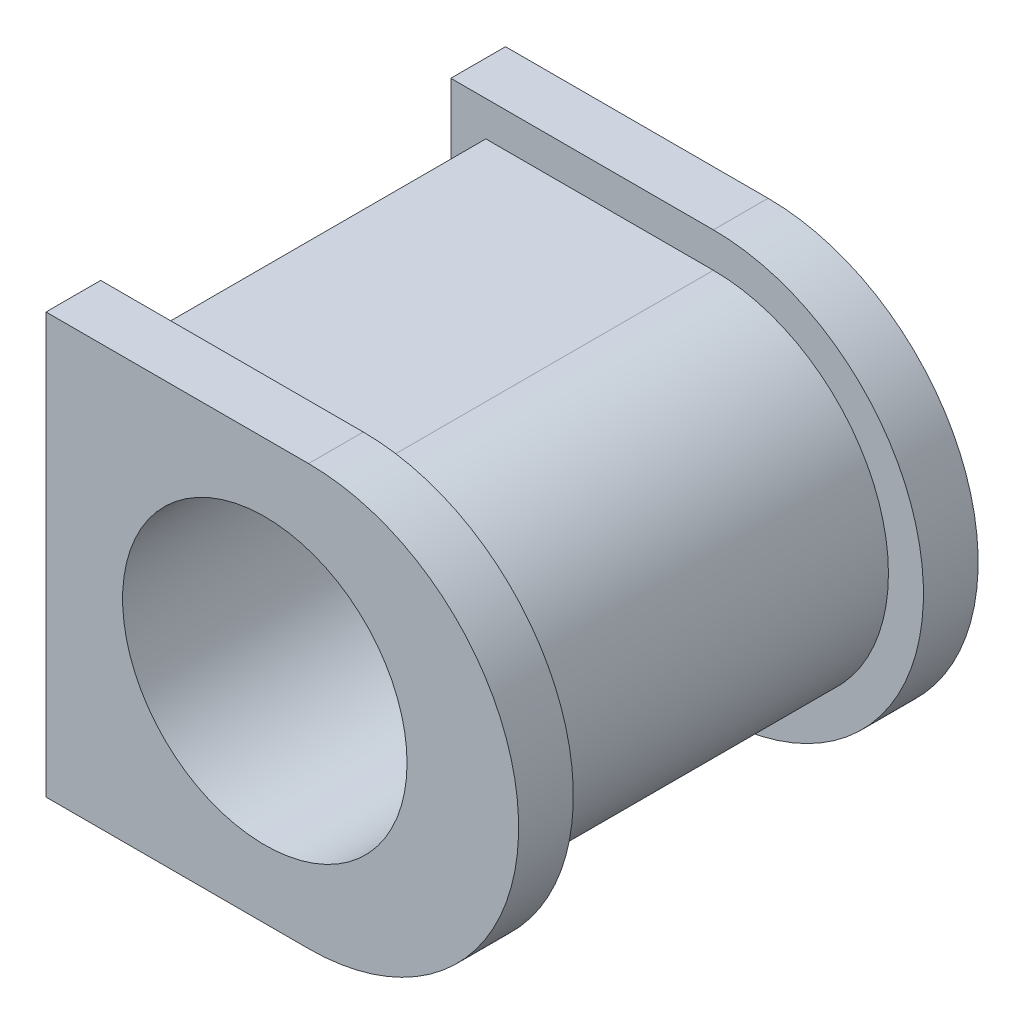
ISO-10303-21;
HEADER;
FILE_DESCRIPTION(('STEP AP214'),'2;1');
FILE_NAME('part.step','',(''),(''),'','','');
FILE_SCHEMA(('AUTOMOTIVE_DESIGN { 1 0 10303 214 1 1 1 1 }'));
ENDSEC;
DATA;
#1=APPLICATION_CONTEXT('core data for automotive mechanical design processes');
#2=APPLICATION_PROTOCOL_DEFINITION('international standard','automotive_design',2000,#1);
#3=PRODUCT_CONTEXT('',#1,'mechanical');
#4=PRODUCT('Part','Part','',(#3));
#5=PRODUCT_RELATED_PRODUCT_CATEGORY('part','',(#4));
#6=PRODUCT_DEFINITION_FORMATION('','',#4);
#7=PRODUCT_DEFINITION_CONTEXT('part definition',#1,'design');
#8=PRODUCT_DEFINITION('design','',#6,#7);
#9=PRODUCT_DEFINITION_SHAPE('','',#8);
#10=(LENGTH_UNIT() NAMED_UNIT(*) SI_UNIT(.MILLI.,.METRE.));
#11=(NAMED_UNIT(*) PLANE_ANGLE_UNIT() SI_UNIT($,.RADIAN.));
#12=(NAMED_UNIT(*) SI_UNIT($,.STERADIAN.) SOLID_ANGLE_UNIT());
#13=UNCERTAINTY_MEASURE_WITH_UNIT(LENGTH_MEASURE(1.E-05),#10,'distance_accuracy_value','');
#14=(GEOMETRIC_REPRESENTATION_CONTEXT(3) GLOBAL_UNCERTAINTY_ASSIGNED_CONTEXT((#13)) GLOBAL_UNIT_ASSIGNED_CONTEXT((#10,
#11,#12)) REPRESENTATION_CONTEXT('',''));
#15=CARTESIAN_POINT('',(0.,0.,0.));
#16=DIRECTION('',(0.,0.,1.));
#17=DIRECTION('',(1.,0.,0.));
#18=AXIS2_PLACEMENT_3D('',#15,#16,#17);
#19=CARTESIAN_POINT('',(26.,0.,40.));
#20=DIRECTION('',(0.,0.,-1.));
#21=DIRECTION('',(-1.,0.,0.));
#22=AXIS2_PLACEMENT_3D('',#19,#20,#21);
#23=CYLINDRICAL_SURFACE('',#22,40.);
#24=CARTESIAN_POINT('',(26.,0.,-40.));
#25=DIRECTION('',(0.,0.,1.));
#26=DIRECTION('',(1.,0.,0.));
#27=AXIS2_PLACEMENT_3D('',#24,#25,#26);
#28=CIRCLE('',#27,40.);
#29=CARTESIAN_POINT('',(26.,-40.,-40.));
#30=VERTEX_POINT('',#29);
#31=CARTESIAN_POINT('',(26.,40.,-40.));
#32=VERTEX_POINT('',#31);
#33=EDGE_CURVE('E195',#30,#32,#28,.T.);
#34=ORIENTED_EDGE('',*,*,#33,.T.);
#35=DIRECTION('',(0.,0.,-1.));
#36=VECTOR('',#35,1.);
#37=CARTESIAN_POINT('',(26.,40.,40.));
#38=LINE('',#37,#36);
#39=CARTESIAN_POINT('',(26.,40.,40.));
#40=VERTEX_POINT('',#39);
#41=EDGE_CURVE('E11',#40,#32,#38,.T.);
#42=ORIENTED_EDGE('',*,*,#41,.F.);
#43=CARTESIAN_POINT('',(26.,0.,40.));
#44=DIRECTION('',(0.,0.,1.));
#45=DIRECTION('',(1.,0.,0.));
#46=AXIS2_PLACEMENT_3D('',#43,#44,#45);
#47=CIRCLE('',#46,40.);
#48=CARTESIAN_POINT('',(26.,-40.,40.));
#49=VERTEX_POINT('',#48);
#50=EDGE_CURVE('E196',#49,#40,#47,.T.);
#51=ORIENTED_EDGE('',*,*,#50,.F.);
#52=DIRECTION('',(0.,0.,-1.));
#53=VECTOR('',#52,1.);
#54=CARTESIAN_POINT('',(26.,-40.,40.));
#55=LINE('',#54,#53);
#56=EDGE_CURVE('E209',#49,#30,#55,.T.);
#57=ORIENTED_EDGE('',*,*,#56,.T.);
#58=EDGE_LOOP('',(#34,#42,#51,#57));
#59=FACE_BOUND('',#58,.T.);
#60=ADVANCED_FACE('F33',(#59),#23,.T.);
#61=CARTESIAN_POINT('',(-26.,40.,40.));
#62=DIRECTION('',(0.,-1.,0.));
#63=DIRECTION('',(0.,0.,-1.));
#64=AXIS2_PLACEMENT_3D('',#61,#62,#63);
#65=PLANE('',#64);
#66=DIRECTION('',(-1.,0.,0.));
#67=VECTOR('',#66,1.);
#68=CARTESIAN_POINT('',(-26.,40.,-40.));
#69=LINE('',#68,#67);
#70=CARTESIAN_POINT('',(-26.,40.,-40.));
#71=VERTEX_POINT('',#70);
#72=EDGE_CURVE('E212',#32,#71,#69,.T.);
#73=ORIENTED_EDGE('',*,*,#72,.T.);
#74=DIRECTION('',(0.,0.,-1.));
#75=VECTOR('',#74,1.);
#76=CARTESIAN_POINT('',(-26.,40.,40.));
#77=LINE('',#76,#75);
#78=CARTESIAN_POINT('',(-26.,40.,40.));
#79=VERTEX_POINT('',#78);
#80=EDGE_CURVE('E41',#79,#71,#77,.T.);
#81=ORIENTED_EDGE('',*,*,#80,.F.);
#82=DIRECTION('',(-1.,0.,0.));
#83=VECTOR('',#82,1.);
#84=CARTESIAN_POINT('',(-26.,40.,40.));
#85=LINE('',#84,#83);
#86=EDGE_CURVE('E199',#40,#79,#85,.T.);
#87=ORIENTED_EDGE('',*,*,#86,.F.);
#88=ORIENTED_EDGE('',*,*,#41,.T.);
#89=EDGE_LOOP('',(#73,#81,#87,#88));
#90=FACE_BOUND('',#89,.T.);
#91=ADVANCED_FACE('F225',(#90),#65,.F.);
#92=CARTESIAN_POINT('',(-26.,-40.,40.));
#93=DIRECTION('',(1.,0.,0.));
#94=DIRECTION('',(0.,0.,-1.));
#95=AXIS2_PLACEMENT_3D('',#92,#93,#94);
#96=PLANE('',#95);
#97=DIRECTION('',(0.,-1.,0.));
#98=VECTOR('',#97,1.);
#99=CARTESIAN_POINT('',(-26.,-40.,-40.));
#100=LINE('',#99,#98);
#101=CARTESIAN_POINT('',(-26.,-40.,-40.));
#102=VERTEX_POINT('',#101);
#103=EDGE_CURVE('E215',#71,#102,#100,.T.);
#104=ORIENTED_EDGE('',*,*,#103,.T.);
#105=DIRECTION('',(0.,0.,-1.));
#106=VECTOR('',#105,1.);
#107=CARTESIAN_POINT('',(-26.,-40.,40.));
#108=LINE('',#107,#106);
#109=CARTESIAN_POINT('',(-26.,-40.,40.));
#110=VERTEX_POINT('',#109);
#111=EDGE_CURVE('E48',#110,#102,#108,.T.);
#112=ORIENTED_EDGE('',*,*,#111,.F.);
#113=DIRECTION('',(0.,-1.,0.));
#114=VECTOR('',#113,1.);
#115=CARTESIAN_POINT('',(-26.,-40.,40.));
#116=LINE('',#115,#114);
#117=EDGE_CURVE('E203',#79,#110,#116,.T.);
#118=ORIENTED_EDGE('',*,*,#117,.F.);
#119=ORIENTED_EDGE('',*,*,#80,.T.);
#120=EDGE_LOOP('',(#104,#112,#118,#119));
#121=FACE_BOUND('',#120,.T.);
#122=ADVANCED_FACE('F222',(#121),#96,.F.);
#123=CARTESIAN_POINT('',(-26.,-40.,40.));
#124=DIRECTION('',(0.,1.,0.));
#125=DIRECTION('',(0.,0.,1.));
#126=AXIS2_PLACEMENT_3D('',#123,#124,#125);
#127=PLANE('',#126);
#128=DIRECTION('',(1.,0.,0.));
#129=VECTOR('',#128,1.);
#130=CARTESIAN_POINT('',(-26.,-40.,-40.));
#131=LINE('',#130,#129);
#132=EDGE_CURVE('E200',#102,#30,#131,.T.);
#133=ORIENTED_EDGE('',*,*,#132,.T.);
#134=ORIENTED_EDGE('',*,*,#56,.F.);
#135=DIRECTION('',(1.,0.,0.));
#136=VECTOR('',#135,1.);
#137=CARTESIAN_POINT('',(-26.,-40.,40.));
#138=LINE('',#137,#136);
#139=EDGE_CURVE('E206',#110,#49,#138,.T.);
#140=ORIENTED_EDGE('',*,*,#139,.F.);
#141=ORIENTED_EDGE('',*,*,#111,.T.);
#142=EDGE_LOOP('',(#133,#134,#140,#141));
#143=FACE_BOUND('',#142,.T.);
#144=ADVANCED_FACE('F232',(#143),#127,.F.);
#145=CARTESIAN_POINT('',(16.,0.,40.));
#146=DIRECTION('',(0.,0.,-1.));
#147=DIRECTION('',(-1.,0.,0.));
#148=AXIS2_PLACEMENT_3D('',#145,#146,#147);
#149=CYLINDRICAL_SURFACE('',#148,32.5);
#150=CARTESIAN_POINT('',(16.,0.,52.5));
#151=DIRECTION('',(0.,0.,1.));
#152=DIRECTION('',(1.,0.,0.));
#153=AXIS2_PLACEMENT_3D('',#150,#151,#152);
#154=CIRCLE('',#153,32.5);
#155=CARTESIAN_POINT('',(48.5,0.,52.5));
#156=VERTEX_POINT('',#155);
#157=EDGE_CURVE('E129',#156,#156,#154,.T.);
#158=ORIENTED_EDGE('',*,*,#157,.T.);
#159=EDGE_LOOP('',(#158));
#160=FACE_BOUND('',#159,.T.);
#161=CARTESIAN_POINT('',(16.,0.,-52.5));
#162=DIRECTION('',(0.,0.,1.));
#163=DIRECTION('',(1.,0.,0.));
#164=AXIS2_PLACEMENT_3D('',#161,#162,#163);
#165=CIRCLE('',#164,32.5);
#166=CARTESIAN_POINT('',(48.5,0.,-52.5));
#167=VERTEX_POINT('',#166);
#168=EDGE_CURVE('E152',#167,#167,#165,.T.);
#169=ORIENTED_EDGE('',*,*,#168,.F.);
#170=EDGE_LOOP('',(#169));
#171=FACE_BOUND('',#170,.T.);
#172=ADVANCED_FACE('F238',(#160,#171),#149,.F.);
#173=CARTESIAN_POINT('',(26.,0.,40.));
#174=DIRECTION('',(0.,0.,1.));
#175=DIRECTION('',(1.,0.,0.));
#176=AXIS2_PLACEMENT_3D('',#173,#174,#175);
#177=PLANE('',#176);
#178=CARTESIAN_POINT('',(26.,0.,40.));
#179=DIRECTION('',(0.,0.,1.));
#180=DIRECTION('',(1.,0.,0.));
#181=AXIS2_PLACEMENT_3D('',#178,#179,#180);
#182=CIRCLE('',#181,48.);
#183=CARTESIAN_POINT('',(26.,-48.,40.));
#184=VERTEX_POINT('',#183);
#185=CARTESIAN_POINT('',(26.,48.,40.));
#186=VERTEX_POINT('',#185);
#187=EDGE_CURVE('E165',#184,#186,#182,.T.);
#188=ORIENTED_EDGE('',*,*,#187,.F.);
#189=DIRECTION('',(1.,0.,0.));
#190=VECTOR('',#189,1.);
#191=CARTESIAN_POINT('',(-34.,-48.,40.));
#192=LINE('',#191,#190);
#193=CARTESIAN_POINT('',(-34.,-48.,40.));
#194=VERTEX_POINT('',#193);
#195=EDGE_CURVE('E170',#194,#184,#192,.T.);
#196=ORIENTED_EDGE('',*,*,#195,.F.);
#197=DIRECTION('',(0.,-1.,0.));
#198=VECTOR('',#197,1.);
#199=CARTESIAN_POINT('',(-34.,48.,40.));
#200=LINE('',#199,#198);
#201=CARTESIAN_POINT('',(-34.,48.,40.));
#202=VERTEX_POINT('',#201);
#203=EDGE_CURVE('E181',#202,#194,#200,.T.);
#204=ORIENTED_EDGE('',*,*,#203,.F.);
#205=DIRECTION('',(-1.,0.,0.));
#206=VECTOR('',#205,1.);
#207=CARTESIAN_POINT('',(26.,48.,40.));
#208=LINE('',#207,#206);
#209=EDGE_CURVE('E179',#186,#202,#208,.T.);
#210=ORIENTED_EDGE('',*,*,#209,.F.);
#211=EDGE_LOOP('',(#188,#196,#204,#210));
#212=FACE_BOUND('',#211,.T.);
#213=ORIENTED_EDGE('',*,*,#139,.T.);
#214=ORIENTED_EDGE('',*,*,#50,.T.);
#215=ORIENTED_EDGE('',*,*,#86,.T.);
#216=ORIENTED_EDGE('',*,*,#117,.T.);
#217=EDGE_LOOP('',(#213,#214,#215,#216));
#218=FACE_BOUND('',#217,.T.);
#219=ADVANCED_FACE('F235',(#212,#218),#177,.F.);
#220=CARTESIAN_POINT('',(26.,0.,52.5));
#221=DIRECTION('',(0.,0.,1.));
#222=DIRECTION('',(1.,0.,0.));
#223=AXIS2_PLACEMENT_3D('',#220,#221,#222);
#224=PLANE('',#223);
#225=CARTESIAN_POINT('',(26.,0.,52.5));
#226=DIRECTION('',(0.,0.,1.));
#227=DIRECTION('',(1.,0.,0.));
#228=AXIS2_PLACEMENT_3D('',#225,#226,#227);
#229=CIRCLE('',#228,48.);
#230=CARTESIAN_POINT('',(26.,-48.,52.5));
#231=VERTEX_POINT('',#230);
#232=CARTESIAN_POINT('',(26.,48.,52.5));
#233=VERTEX_POINT('',#232);
#234=EDGE_CURVE('E166',#231,#233,#229,.T.);
#235=ORIENTED_EDGE('',*,*,#234,.T.);
#236=DIRECTION('',(-1.,0.,0.));
#237=VECTOR('',#236,1.);
#238=CARTESIAN_POINT('',(26.,48.,52.5));
#239=LINE('',#238,#237);
#240=CARTESIAN_POINT('',(-34.,48.,52.5));
#241=VERTEX_POINT('',#240);
#242=EDGE_CURVE('E169',#233,#241,#239,.T.);
#243=ORIENTED_EDGE('',*,*,#242,.T.);
#244=DIRECTION('',(0.,-1.,0.));
#245=VECTOR('',#244,1.);
#246=CARTESIAN_POINT('',(-34.,48.,52.5));
#247=LINE('',#246,#245);
#248=CARTESIAN_POINT('',(-34.,-48.,52.5));
#249=VERTEX_POINT('',#248);
#250=EDGE_CURVE('E172',#241,#249,#247,.T.);
#251=ORIENTED_EDGE('',*,*,#250,.T.);
#252=DIRECTION('',(1.,0.,0.));
#253=VECTOR('',#252,1.);
#254=CARTESIAN_POINT('',(-34.,-48.,52.5));
#255=LINE('',#254,#253);
#256=EDGE_CURVE('E174',#249,#231,#255,.T.);
#257=ORIENTED_EDGE('',*,*,#256,.T.);
#258=EDGE_LOOP('',(#235,#243,#251,#257));
#259=FACE_BOUND('',#258,.T.);
#260=ORIENTED_EDGE('',*,*,#157,.F.);
#261=EDGE_LOOP('',(#260));
#262=FACE_BOUND('',#261,.T.);
#263=ADVANCED_FACE('F237',(#259,#262),#224,.T.);
#264=CARTESIAN_POINT('',(26.,0.,52.5));
#265=DIRECTION('',(0.,0.,-1.));
#266=DIRECTION('',(-1.,0.,0.));
#267=AXIS2_PLACEMENT_3D('',#264,#265,#266);
#268=CYLINDRICAL_SURFACE('',#267,48.);
#269=ORIENTED_EDGE('',*,*,#187,.T.);
#270=DIRECTION('',(0.,0.,-1.));
#271=VECTOR('',#270,1.);
#272=CARTESIAN_POINT('',(26.,48.,52.5));
#273=LINE('',#272,#271);
#274=EDGE_CURVE('E192',#233,#186,#273,.T.);
#275=ORIENTED_EDGE('',*,*,#274,.F.);
#276=ORIENTED_EDGE('',*,*,#234,.F.);
#277=DIRECTION('',(0.,0.,-1.));
#278=VECTOR('',#277,1.);
#279=CARTESIAN_POINT('',(26.,-48.,52.5));
#280=LINE('',#279,#278);
#281=EDGE_CURVE('E176',#231,#184,#280,.T.);
#282=ORIENTED_EDGE('',*,*,#281,.T.);
#283=EDGE_LOOP('',(#269,#275,#276,#282));
#284=FACE_BOUND('',#283,.T.);
#285=ADVANCED_FACE('F245',(#284),#268,.T.);
#286=CARTESIAN_POINT('',(26.,48.,52.5));
#287=DIRECTION('',(0.,-1.,0.));
#288=DIRECTION('',(0.,0.,-1.));
#289=AXIS2_PLACEMENT_3D('',#286,#287,#288);
#290=PLANE('',#289);
#291=ORIENTED_EDGE('',*,*,#209,.T.);
#292=DIRECTION('',(0.,0.,-1.));
#293=VECTOR('',#292,1.);
#294=CARTESIAN_POINT('',(-34.,48.,52.5));
#295=LINE('',#294,#293);
#296=EDGE_CURVE('E189',#241,#202,#295,.T.);
#297=ORIENTED_EDGE('',*,*,#296,.F.);
#298=ORIENTED_EDGE('',*,*,#242,.F.);
#299=ORIENTED_EDGE('',*,*,#274,.T.);
#300=EDGE_LOOP('',(#291,#297,#298,#299));
#301=FACE_BOUND('',#300,.T.);
#302=ADVANCED_FACE('F265',(#301),#290,.F.);
#303=CARTESIAN_POINT('',(-34.,48.,52.5));
#304=DIRECTION('',(1.,0.,0.));
#305=DIRECTION('',(0.,0.,-1.));
#306=AXIS2_PLACEMENT_3D('',#303,#304,#305);
#307=PLANE('',#306);
#308=ORIENTED_EDGE('',*,*,#203,.T.);
#309=DIRECTION('',(0.,0.,-1.));
#310=VECTOR('',#309,1.);
#311=CARTESIAN_POINT('',(-34.,-48.,52.5));
#312=LINE('',#311,#310);
#313=EDGE_CURVE('E186',#249,#194,#312,.T.);
#314=ORIENTED_EDGE('',*,*,#313,.F.);
#315=ORIENTED_EDGE('',*,*,#250,.F.);
#316=ORIENTED_EDGE('',*,*,#296,.T.);
#317=EDGE_LOOP('',(#308,#314,#315,#316));
#318=FACE_BOUND('',#317,.T.);
#319=ADVANCED_FACE('F269',(#318),#307,.F.);
#320=CARTESIAN_POINT('',(-34.,-48.,52.5));
#321=DIRECTION('',(0.,1.,0.));
#322=DIRECTION('',(0.,0.,1.));
#323=AXIS2_PLACEMENT_3D('',#320,#321,#322);
#324=PLANE('',#323);
#325=ORIENTED_EDGE('',*,*,#195,.T.);
#326=ORIENTED_EDGE('',*,*,#281,.F.);
#327=ORIENTED_EDGE('',*,*,#256,.F.);
#328=ORIENTED_EDGE('',*,*,#313,.T.);
#329=EDGE_LOOP('',(#325,#326,#327,#328));
#330=FACE_BOUND('',#329,.T.);
#331=ADVANCED_FACE('F272',(#330),#324,.F.);
#332=CARTESIAN_POINT('',(26.,0.,-52.5));
#333=DIRECTION('',(0.,0.,1.));
#334=DIRECTION('',(1.,0.,0.));
#335=AXIS2_PLACEMENT_3D('',#332,#333,#334);
#336=CYLINDRICAL_SURFACE('',#335,48.);
#337=CARTESIAN_POINT('',(26.,0.,-40.));
#338=DIRECTION('',(0.,0.,1.));
#339=DIRECTION('',(1.,0.,0.));
#340=AXIS2_PLACEMENT_3D('',#337,#338,#339);
#341=CIRCLE('',#340,48.);
#342=CARTESIAN_POINT('',(26.,-48.,-40.));
#343=VERTEX_POINT('',#342);
#344=CARTESIAN_POINT('',(26.,48.,-40.));
#345=VERTEX_POINT('',#344);
#346=EDGE_CURVE('E124',#343,#345,#341,.T.);
#347=ORIENTED_EDGE('',*,*,#346,.F.);
#348=DIRECTION('',(0.,0.,1.));
#349=VECTOR('',#348,1.);
#350=CARTESIAN_POINT('',(26.,-48.,-52.5));
#351=LINE('',#350,#349);
#352=CARTESIAN_POINT('',(26.,-48.,-52.5));
#353=VERTEX_POINT('',#352);
#354=EDGE_CURVE('E118',#353,#343,#351,.T.);
#355=ORIENTED_EDGE('',*,*,#354,.F.);
#356=CARTESIAN_POINT('',(26.,0.,-52.5));
#357=DIRECTION('',(0.,0.,1.));
#358=DIRECTION('',(1.,0.,0.));
#359=AXIS2_PLACEMENT_3D('',#356,#357,#358);
#360=CIRCLE('',#359,48.);
#361=CARTESIAN_POINT('',(26.,48.,-52.5));
#362=VERTEX_POINT('',#361);
#363=EDGE_CURVE('E121',#353,#362,#360,.T.);
#364=ORIENTED_EDGE('',*,*,#363,.T.);
#365=DIRECTION('',(0.,0.,1.));
#366=VECTOR('',#365,1.);
#367=CARTESIAN_POINT('',(26.,48.,-52.5));
#368=LINE('',#367,#366);
#369=EDGE_CURVE('E149',#362,#345,#368,.T.);
#370=ORIENTED_EDGE('',*,*,#369,.T.);
#371=EDGE_LOOP('',(#347,#355,#364,#370));
#372=FACE_BOUND('',#371,.T.);
#373=ADVANCED_FACE('F120',(#372),#336,.T.);
#374=CARTESIAN_POINT('',(-34.,-48.,-52.5));
#375=DIRECTION('',(0.,-1.,0.));
#376=DIRECTION('',(0.,0.,-1.));
#377=AXIS2_PLACEMENT_3D('',#374,#375,#376);
#378=PLANE('',#377);
#379=DIRECTION('',(1.,0.,0.));
#380=VECTOR('',#379,1.);
#381=CARTESIAN_POINT('',(-34.,-48.,-40.));
#382=LINE('',#381,#380);
#383=CARTESIAN_POINT('',(-34.,-48.,-40.));
#384=VERTEX_POINT('',#383);
#385=EDGE_CURVE('E151',#384,#343,#382,.T.);
#386=ORIENTED_EDGE('',*,*,#385,.F.);
#387=DIRECTION('',(0.,0.,1.));
#388=VECTOR('',#387,1.);
#389=CARTESIAN_POINT('',(-34.,-48.,-52.5));
#390=LINE('',#389,#388);
#391=CARTESIAN_POINT('',(-34.,-48.,-52.5));
#392=VERTEX_POINT('',#391);
#393=EDGE_CURVE('E130',#392,#384,#390,.T.);
#394=ORIENTED_EDGE('',*,*,#393,.F.);
#395=DIRECTION('',(1.,0.,0.));
#396=VECTOR('',#395,1.);
#397=CARTESIAN_POINT('',(-34.,-48.,-52.5));
#398=LINE('',#397,#396);
#399=EDGE_CURVE('E136',#392,#353,#398,.T.);
#400=ORIENTED_EDGE('',*,*,#399,.T.);
#401=ORIENTED_EDGE('',*,*,#354,.T.);
#402=EDGE_LOOP('',(#386,#394,#400,#401));
#403=FACE_BOUND('',#402,.T.);
#404=ADVANCED_FACE('F142',(#403),#378,.T.);
#405=CARTESIAN_POINT('',(-34.,48.,-52.5));
#406=DIRECTION('',(-1.,0.,0.));
#407=DIRECTION('',(0.,0.,1.));
#408=AXIS2_PLACEMENT_3D('',#405,#406,#407);
#409=PLANE('',#408);
#410=DIRECTION('',(0.,-1.,0.));
#411=VECTOR('',#410,1.);
#412=CARTESIAN_POINT('',(-34.,48.,-40.));
#413=LINE('',#412,#411);
#414=CARTESIAN_POINT('',(-34.,48.,-40.));
#415=VERTEX_POINT('',#414);
#416=EDGE_CURVE('E154',#415,#384,#413,.T.);
#417=ORIENTED_EDGE('',*,*,#416,.F.);
#418=DIRECTION('',(0.,0.,1.));
#419=VECTOR('',#418,1.);
#420=CARTESIAN_POINT('',(-34.,48.,-52.5));
#421=LINE('',#420,#419);
#422=CARTESIAN_POINT('',(-34.,48.,-52.5));
#423=VERTEX_POINT('',#422);
#424=EDGE_CURVE('E160',#423,#415,#421,.T.);
#425=ORIENTED_EDGE('',*,*,#424,.F.);
#426=DIRECTION('',(0.,-1.,0.));
#427=VECTOR('',#426,1.);
#428=CARTESIAN_POINT('',(-34.,48.,-52.5));
#429=LINE('',#428,#427);
#430=EDGE_CURVE('E143',#423,#392,#429,.T.);
#431=ORIENTED_EDGE('',*,*,#430,.T.);
#432=ORIENTED_EDGE('',*,*,#393,.T.);
#433=EDGE_LOOP('',(#417,#425,#431,#432));
#434=FACE_BOUND('',#433,.T.);
#435=ADVANCED_FACE('F303',(#434),#409,.T.);
#436=CARTESIAN_POINT('',(26.,48.,-52.5));
#437=DIRECTION('',(0.,1.,0.));
#438=DIRECTION('',(0.,0.,1.));
#439=AXIS2_PLACEMENT_3D('',#436,#437,#438);
#440=PLANE('',#439);
#441=DIRECTION('',(-1.,0.,0.));
#442=VECTOR('',#441,1.);
#443=CARTESIAN_POINT('',(26.,48.,-40.));
#444=LINE('',#443,#442);
#445=EDGE_CURVE('E140',#345,#415,#444,.T.);
#446=ORIENTED_EDGE('',*,*,#445,.F.);
#447=ORIENTED_EDGE('',*,*,#369,.F.);
#448=DIRECTION('',(-1.,0.,0.));
#449=VECTOR('',#448,1.);
#450=CARTESIAN_POINT('',(26.,48.,-52.5));
#451=LINE('',#450,#449);
#452=EDGE_CURVE('E139',#362,#423,#451,.T.);
#453=ORIENTED_EDGE('',*,*,#452,.T.);
#454=ORIENTED_EDGE('',*,*,#424,.T.);
#455=EDGE_LOOP('',(#446,#447,#453,#454));
#456=FACE_BOUND('',#455,.T.);
#457=ADVANCED_FACE('F296',(#456),#440,.T.);
#458=CARTESIAN_POINT('',(26.,0.,-52.5));
#459=DIRECTION('',(0.,0.,-1.));
#460=DIRECTION('',(1.,0.,0.));
#461=AXIS2_PLACEMENT_3D('',#458,#459,#460);
#462=PLANE('',#461);
#463=ORIENTED_EDGE('',*,*,#168,.T.);
#464=EDGE_LOOP('',(#463));
#465=FACE_BOUND('',#464,.T.);
#466=ORIENTED_EDGE('',*,*,#363,.F.);
#467=ORIENTED_EDGE('',*,*,#399,.F.);
#468=ORIENTED_EDGE('',*,*,#430,.F.);
#469=ORIENTED_EDGE('',*,*,#452,.F.);
#470=EDGE_LOOP('',(#466,#467,#468,#469));
#471=FACE_BOUND('',#470,.T.);
#472=ADVANCED_FACE('F134',(#465,#471),#462,.T.);
#473=CARTESIAN_POINT('',(26.,0.,-40.));
#474=DIRECTION('',(0.,0.,-1.));
#475=DIRECTION('',(1.,0.,0.));
#476=AXIS2_PLACEMENT_3D('',#473,#474,#475);
#477=PLANE('',#476);
#478=ORIENTED_EDGE('',*,*,#33,.F.);
#479=ORIENTED_EDGE('',*,*,#132,.F.);
#480=ORIENTED_EDGE('',*,*,#103,.F.);
#481=ORIENTED_EDGE('',*,*,#72,.F.);
#482=EDGE_LOOP('',(#478,#479,#480,#481));
#483=FACE_BOUND('',#482,.T.);
#484=ORIENTED_EDGE('',*,*,#346,.T.);
#485=ORIENTED_EDGE('',*,*,#445,.T.);
#486=ORIENTED_EDGE('',*,*,#416,.T.);
#487=ORIENTED_EDGE('',*,*,#385,.T.);
#488=EDGE_LOOP('',(#484,#485,#486,#487));
#489=FACE_BOUND('',#488,.T.);
#490=ADVANCED_FACE('F228',(#483,#489),#477,.F.);
#491=CLOSED_SHELL('',(#60,#91,#122,#144,#172,#219,#263,#285,#302,#319,#331,#373,#404,#435,#457,
#472,#490));
#492=MANIFOLD_SOLID_BREP('B2',#491);
#493=ADVANCED_BREP_SHAPE_REPRESENTATION('',(#18,#492),#14);
#494=SHAPE_DEFINITION_REPRESENTATION(#9,#493);
ENDSEC;
END-ISO-10303-21;
